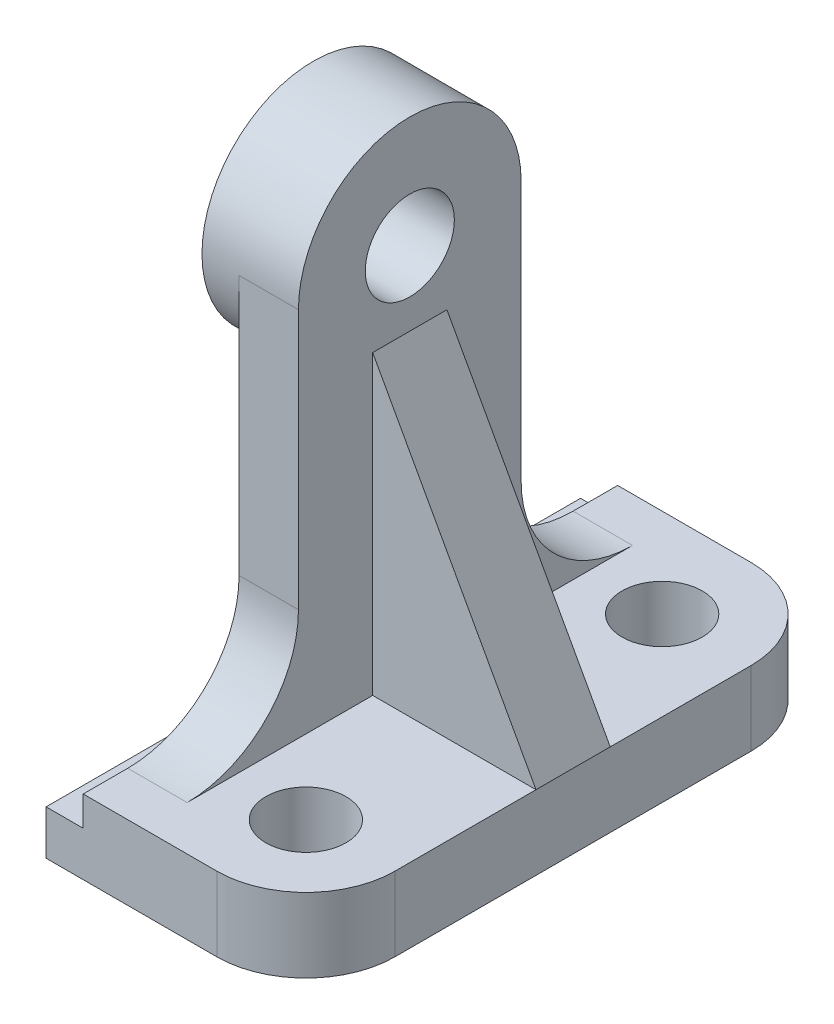
ISO-10303-21;
HEADER;
FILE_DESCRIPTION(('STEP AP214'),'2;1');
FILE_NAME('part.step','',(''),(''),'','','');
FILE_SCHEMA(('AUTOMOTIVE_DESIGN { 1 0 10303 214 1 1 1 1 }'));
ENDSEC;
DATA;
#1=APPLICATION_CONTEXT('core data for automotive mechanical design processes');
#2=APPLICATION_PROTOCOL_DEFINITION('international standard','automotive_design',2000,#1);
#3=PRODUCT_CONTEXT('',#1,'mechanical');
#4=PRODUCT('Part','Part','',(#3));
#5=PRODUCT_RELATED_PRODUCT_CATEGORY('part','',(#4));
#6=PRODUCT_DEFINITION_FORMATION('','',#4);
#7=PRODUCT_DEFINITION_CONTEXT('part definition',#1,'design');
#8=PRODUCT_DEFINITION('design','',#6,#7);
#9=PRODUCT_DEFINITION_SHAPE('','',#8);
#10=(LENGTH_UNIT() NAMED_UNIT(*) SI_UNIT(.MILLI.,.METRE.));
#11=(NAMED_UNIT(*) PLANE_ANGLE_UNIT() SI_UNIT($,.RADIAN.));
#12=(NAMED_UNIT(*) SI_UNIT($,.STERADIAN.) SOLID_ANGLE_UNIT());
#13=UNCERTAINTY_MEASURE_WITH_UNIT(LENGTH_MEASURE(1.E-05),#10,'distance_accuracy_value','');
#14=(GEOMETRIC_REPRESENTATION_CONTEXT(3) GLOBAL_UNCERTAINTY_ASSIGNED_CONTEXT((#13)) GLOBAL_UNIT_ASSIGNED_CONTEXT((#10,
#11,#12)) REPRESENTATION_CONTEXT('',''));
#15=CARTESIAN_POINT('',(0.,0.,0.));
#16=DIRECTION('',(0.,0.,1.));
#17=DIRECTION('',(1.,0.,0.));
#18=AXIS2_PLACEMENT_3D('',#15,#16,#17);
#19=CARTESIAN_POINT('',(5.,10.,36.));
#20=DIRECTION('',(0.,-1.,0.));
#21=DIRECTION('',(0.,0.,-1.));
#22=AXIS2_PLACEMENT_3D('',#19,#20,#21);
#23=PLANE('',#22);
#24=CARTESIAN_POINT('',(23.,10.,-24.));
#25=DIRECTION('',(0.,1.,0.));
#26=DIRECTION('',(0.,0.,1.));
#27=AXIS2_PLACEMENT_3D('',#24,#25,#26);
#28=CIRCLE('',#27,5.4);
#29=CARTESIAN_POINT('',(23.,10.,-18.6));
#30=VERTEX_POINT('',#29);
#31=EDGE_CURVE('E206',#30,#30,#28,.T.);
#32=ORIENTED_EDGE('',*,*,#31,.F.);
#33=EDGE_LOOP('',(#32));
#34=FACE_BOUND('',#33,.T.);
#35=DIRECTION('',(-1.,0.,0.));
#36=VECTOR('',#35,1.);
#37=CARTESIAN_POINT('',(5.,10.,-5.));
#38=LINE('',#37,#36);
#39=CARTESIAN_POINT('',(35.,9.99999999999999,-5.));
#40=VERTEX_POINT('',#39);
#41=CARTESIAN_POINT('',(13.,10.,-5.));
#42=VERTEX_POINT('',#41);
#43=EDGE_CURVE('E176',#40,#42,#38,.T.);
#44=ORIENTED_EDGE('',*,*,#43,.F.);
#45=DIRECTION('',(0.,0.,-1.));
#46=VECTOR('',#45,1.);
#47=CARTESIAN_POINT('',(35.,10.,36.));
#48=LINE('',#47,#46);
#49=CARTESIAN_POINT('',(35.,10.,-24.));
#50=VERTEX_POINT('',#49);
#51=EDGE_CURVE('E160',#40,#50,#48,.T.);
#52=ORIENTED_EDGE('',*,*,#51,.T.);
#53=CARTESIAN_POINT('',(23.,10.,-24.));
#54=DIRECTION('',(0.,-1.,0.));
#55=DIRECTION('',(0.,0.,-1.));
#56=AXIS2_PLACEMENT_3D('',#53,#54,#55);
#57=CIRCLE('',#56,12.);
#58=CARTESIAN_POINT('',(23.,10.,-36.));
#59=VERTEX_POINT('',#58);
#60=EDGE_CURVE('E287',#50,#59,#57,.F.);
#61=ORIENTED_EDGE('',*,*,#60,.T.);
#62=DIRECTION('',(-1.,0.,0.));
#63=VECTOR('',#62,1.);
#64=CARTESIAN_POINT('',(5.,10.,-36.));
#65=LINE('',#64,#63);
#66=CARTESIAN_POINT('',(5.,10.,-36.));
#67=VERTEX_POINT('',#66);
#68=EDGE_CURVE('E261',#59,#67,#65,.T.);
#69=ORIENTED_EDGE('',*,*,#68,.T.);
#70=DIRECTION('',(0.,0.,-1.));
#71=VECTOR('',#70,1.);
#72=CARTESIAN_POINT('',(5.,10.,36.));
#73=LINE('',#72,#71);
#74=CARTESIAN_POINT('',(5.,10.,-30.));
#75=VERTEX_POINT('',#74);
#76=EDGE_CURVE('E277',#75,#67,#73,.T.);
#77=ORIENTED_EDGE('',*,*,#76,.F.);
#78=DIRECTION('',(-1.,0.,0.));
#79=VECTOR('',#78,1.);
#80=CARTESIAN_POINT('',(5.,10.,-30.));
#81=LINE('',#80,#79);
#82=CARTESIAN_POINT('',(13.,10.,-30.));
#83=VERTEX_POINT('',#82);
#84=EDGE_CURVE('E305',#75,#83,#81,.F.);
#85=ORIENTED_EDGE('',*,*,#84,.T.);
#86=DIRECTION('',(0.,0.,1.));
#87=VECTOR('',#86,1.);
#88=CARTESIAN_POINT('',(13.,10.,-15.));
#89=LINE('',#88,#87);
#90=EDGE_CURVE('E178',#83,#42,#89,.T.);
#91=ORIENTED_EDGE('',*,*,#90,.T.);
#92=EDGE_LOOP('',(#44,#52,#61,#69,#77,#85,#91));
#93=FACE_BOUND('',#92,.T.);
#94=ADVANCED_FACE('F43',(#34,#93),#23,.F.);
#95=CARTESIAN_POINT('',(35.,10.,24.));
#96=VERTEX_POINT('',#95);
#97=CARTESIAN_POINT('',(35.,10.,5.));
#98=VERTEX_POINT('',#97);
#99=EDGE_CURVE('E171',#96,#98,#48,.T.);
#100=ORIENTED_EDGE('',*,*,#99,.T.);
#101=DIRECTION('',(-1.,0.,0.));
#102=VECTOR('',#101,1.);
#103=CARTESIAN_POINT('',(5.,10.,5.));
#104=LINE('',#103,#102);
#105=CARTESIAN_POINT('',(13.,10.,5.));
#106=VERTEX_POINT('',#105);
#107=EDGE_CURVE('E196',#98,#106,#104,.T.);
#108=ORIENTED_EDGE('',*,*,#107,.T.);
#109=CARTESIAN_POINT('',(13.,10.,30.));
#110=VERTEX_POINT('',#109);
#111=EDGE_CURVE('E231',#106,#110,#89,.T.);
#112=ORIENTED_EDGE('',*,*,#111,.T.);
#113=DIRECTION('',(-1.,0.,0.));
#114=VECTOR('',#113,1.);
#115=CARTESIAN_POINT('',(5.,10.,30.));
#116=LINE('',#115,#114);
#117=CARTESIAN_POINT('',(5.,10.,30.));
#118=VERTEX_POINT('',#117);
#119=EDGE_CURVE('E302',#110,#118,#116,.T.);
#120=ORIENTED_EDGE('',*,*,#119,.T.);
#121=CARTESIAN_POINT('',(5.,10.,36.));
#122=VERTEX_POINT('',#121);
#123=EDGE_CURVE('E172',#122,#118,#73,.T.);
#124=ORIENTED_EDGE('',*,*,#123,.F.);
#125=DIRECTION('',(-1.,0.,0.));
#126=VECTOR('',#125,1.);
#127=CARTESIAN_POINT('',(5.,10.,36.));
#128=LINE('',#127,#126);
#129=CARTESIAN_POINT('',(23.,10.,36.));
#130=VERTEX_POINT('',#129);
#131=EDGE_CURVE('E249',#130,#122,#128,.T.);
#132=ORIENTED_EDGE('',*,*,#131,.F.);
#133=CARTESIAN_POINT('',(23.,10.,24.));
#134=DIRECTION('',(0.,-1.,0.));
#135=DIRECTION('',(0.,0.,-1.));
#136=AXIS2_PLACEMENT_3D('',#133,#134,#135);
#137=CIRCLE('',#136,12.);
#138=EDGE_CURVE('E285',#130,#96,#137,.F.);
#139=ORIENTED_EDGE('',*,*,#138,.T.);
#140=EDGE_LOOP('',(#100,#108,#112,#120,#124,#132,#139));
#141=FACE_BOUND('',#140,.T.);
#142=CARTESIAN_POINT('',(23.,10.,24.));
#143=DIRECTION('',(0.,1.,0.));
#144=DIRECTION('',(0.,0.,1.));
#145=AXIS2_PLACEMENT_3D('',#142,#143,#144);
#146=CIRCLE('',#145,5.4);
#147=CARTESIAN_POINT('',(23.,10.,29.4));
#148=VERTEX_POINT('',#147);
#149=EDGE_CURVE('E200',#148,#148,#146,.T.);
#150=ORIENTED_EDGE('',*,*,#149,.F.);
#151=EDGE_LOOP('',(#150));
#152=FACE_BOUND('',#151,.T.);
#153=ADVANCED_FACE('F359',(#141,#152),#23,.F.);
#154=CARTESIAN_POINT('',(13.,60.,0.));
#155=DIRECTION('',(-1.,0.,0.));
#156=DIRECTION('',(0.,0.,1.));
#157=AXIS2_PLACEMENT_3D('',#154,#155,#156);
#158=PLANE('',#157);
#159=ORIENTED_EDGE('',*,*,#111,.F.);
#160=DIRECTION('',(0.,1.,0.));
#161=VECTOR('',#160,1.);
#162=CARTESIAN_POINT('',(13.,60.,5.));
#163=LINE('',#162,#161);
#164=CARTESIAN_POINT('',(13.,50.,5.));
#165=VERTEX_POINT('',#164);
#166=EDGE_CURVE('E58',#106,#165,#163,.T.);
#167=ORIENTED_EDGE('',*,*,#166,.T.);
#168=DIRECTION('',(0.,0.,1.));
#169=VECTOR('',#168,1.);
#170=CARTESIAN_POINT('',(13.,50.,0.));
#171=LINE('',#170,#169);
#172=CARTESIAN_POINT('',(13.,50.,-5.));
#173=VERTEX_POINT('',#172);
#174=EDGE_CURVE('E62',#165,#173,#171,.F.);
#175=ORIENTED_EDGE('',*,*,#174,.T.);
#176=DIRECTION('',(0.,1.,0.));
#177=VECTOR('',#176,1.);
#178=CARTESIAN_POINT('',(13.,60.,-5.));
#179=LINE('',#178,#177);
#180=EDGE_CURVE('E181',#42,#173,#179,.T.);
#181=ORIENTED_EDGE('',*,*,#180,.F.);
#182=ORIENTED_EDGE('',*,*,#90,.F.);
#183=CARTESIAN_POINT('',(13.,25.,-30.));
#184=DIRECTION('',(-1.,0.,0.));
#185=DIRECTION('',(0.,0.,1.));
#186=AXIS2_PLACEMENT_3D('',#183,#184,#185);
#187=CIRCLE('',#186,15.);
#188=CARTESIAN_POINT('',(13.,25.,-15.));
#189=VERTEX_POINT('',#188);
#190=EDGE_CURVE('E311',#83,#189,#187,.T.);
#191=ORIENTED_EDGE('',*,*,#190,.T.);
#192=DIRECTION('',(0.,-1.,0.));
#193=VECTOR('',#192,1.);
#194=CARTESIAN_POINT('',(13.,60.,-15.));
#195=LINE('',#194,#193);
#196=CARTESIAN_POINT('',(13.,60.,-15.));
#197=VERTEX_POINT('',#196);
#198=EDGE_CURVE('E227',#197,#189,#195,.T.);
#199=ORIENTED_EDGE('',*,*,#198,.F.);
#200=CARTESIAN_POINT('',(13.,60.,0.));
#201=DIRECTION('',(-1.,0.,0.));
#202=DIRECTION('',(0.,0.,1.));
#203=AXIS2_PLACEMENT_3D('',#200,#201,#202);
#204=CIRCLE('',#203,15.);
#205=CARTESIAN_POINT('',(13.,60.,15.));
#206=VERTEX_POINT('',#205);
#207=EDGE_CURVE('E224',#206,#197,#204,.T.);
#208=ORIENTED_EDGE('',*,*,#207,.F.);
#209=DIRECTION('',(0.,1.,0.));
#210=VECTOR('',#209,1.);
#211=CARTESIAN_POINT('',(13.,10.,15.));
#212=LINE('',#211,#210);
#213=CARTESIAN_POINT('',(13.,25.,15.));
#214=VERTEX_POINT('',#213);
#215=EDGE_CURVE('E233',#214,#206,#212,.T.);
#216=ORIENTED_EDGE('',*,*,#215,.F.);
#217=CARTESIAN_POINT('',(13.,25.,30.));
#218=DIRECTION('',(-1.,0.,0.));
#219=DIRECTION('',(0.,0.,1.));
#220=AXIS2_PLACEMENT_3D('',#217,#218,#219);
#221=CIRCLE('',#220,15.);
#222=EDGE_CURVE('E11',#214,#110,#221,.T.);
#223=ORIENTED_EDGE('',*,*,#222,.T.);
#224=EDGE_LOOP('',(#159,#167,#175,#181,#182,#191,#199,#208,#216,#223));
#225=FACE_BOUND('',#224,.T.);
#226=CARTESIAN_POINT('',(13.,60.,0.));
#227=DIRECTION('',(1.,0.,0.));
#228=DIRECTION('',(0.,0.,-1.));
#229=AXIS2_PLACEMENT_3D('',#226,#227,#228);
#230=CIRCLE('',#229,6.00000000000002);
#231=CARTESIAN_POINT('',(13.,60.,-6.00000000000002));
#232=VERTEX_POINT('',#231);
#233=EDGE_CURVE('E212',#232,#232,#230,.T.);
#234=ORIENTED_EDGE('',*,*,#233,.F.);
#235=EDGE_LOOP('',(#234));
#236=FACE_BOUND('',#235,.T.);
#237=ADVANCED_FACE('F326',(#225,#236),#158,.F.);
#238=CARTESIAN_POINT('',(5.,6.,36.));
#239=DIRECTION('',(1.,0.,0.));
#240=DIRECTION('',(0.,0.,-1.));
#241=AXIS2_PLACEMENT_3D('',#238,#239,#240);
#242=PLANE('',#241);
#243=DIRECTION('',(0.,1.,0.));
#244=VECTOR('',#243,1.);
#245=CARTESIAN_POINT('',(5.,10.,15.));
#246=LINE('',#245,#244);
#247=CARTESIAN_POINT('',(5.,25.,15.));
#248=VERTEX_POINT('',#247);
#249=CARTESIAN_POINT('',(5.,60.,15.));
#250=VERTEX_POINT('',#249);
#251=EDGE_CURVE('E228',#248,#250,#246,.T.);
#252=ORIENTED_EDGE('',*,*,#251,.T.);
#253=CARTESIAN_POINT('',(5.,60.,0.));
#254=DIRECTION('',(-1.,0.,0.));
#255=DIRECTION('',(0.,0.,1.));
#256=AXIS2_PLACEMENT_3D('',#253,#254,#255);
#257=CIRCLE('',#256,15.);
#258=CARTESIAN_POINT('',(5.,60.,-15.));
#259=VERTEX_POINT('',#258);
#260=EDGE_CURVE('E218',#259,#250,#257,.T.);
#261=ORIENTED_EDGE('',*,*,#260,.F.);
#262=DIRECTION('',(0.,-1.,0.));
#263=VECTOR('',#262,1.);
#264=CARTESIAN_POINT('',(5.,60.,-15.));
#265=LINE('',#264,#263);
#266=CARTESIAN_POINT('',(5.,25.,-15.));
#267=VERTEX_POINT('',#266);
#268=EDGE_CURVE('E222',#259,#267,#265,.T.);
#269=ORIENTED_EDGE('',*,*,#268,.T.);
#270=CARTESIAN_POINT('',(5.,25.,-30.));
#271=DIRECTION('',(1.,0.,0.));
#272=DIRECTION('',(0.,0.,-1.));
#273=AXIS2_PLACEMENT_3D('',#270,#271,#272);
#274=CIRCLE('',#273,15.);
#275=EDGE_CURVE('E309',#267,#75,#274,.T.);
#276=ORIENTED_EDGE('',*,*,#275,.T.);
#277=ORIENTED_EDGE('',*,*,#76,.T.);
#278=DIRECTION('',(0.,-1.,0.));
#279=VECTOR('',#278,1.);
#280=CARTESIAN_POINT('',(5.,6.,-36.));
#281=LINE('',#280,#279);
#282=CARTESIAN_POINT('',(5.,6.,-36.));
#283=VERTEX_POINT('',#282);
#284=EDGE_CURVE('E264',#67,#283,#281,.T.);
#285=ORIENTED_EDGE('',*,*,#284,.T.);
#286=DIRECTION('',(0.,0.,-1.));
#287=VECTOR('',#286,1.);
#288=CARTESIAN_POINT('',(5.,6.,36.));
#289=LINE('',#288,#287);
#290=CARTESIAN_POINT('',(5.,6.,36.));
#291=VERTEX_POINT('',#290);
#292=EDGE_CURVE('E275',#291,#283,#289,.T.);
#293=ORIENTED_EDGE('',*,*,#292,.F.);
#294=DIRECTION('',(0.,-1.,0.));
#295=VECTOR('',#294,1.);
#296=CARTESIAN_POINT('',(5.,6.,36.));
#297=LINE('',#296,#295);
#298=EDGE_CURVE('E252',#122,#291,#297,.T.);
#299=ORIENTED_EDGE('',*,*,#298,.F.);
#300=ORIENTED_EDGE('',*,*,#123,.T.);
#301=CARTESIAN_POINT('',(5.,25.,30.));
#302=DIRECTION('',(1.,0.,0.));
#303=DIRECTION('',(0.,0.,-1.));
#304=AXIS2_PLACEMENT_3D('',#301,#302,#303);
#305=CIRCLE('',#304,15.);
#306=EDGE_CURVE('E51',#118,#248,#305,.T.);
#307=ORIENTED_EDGE('',*,*,#306,.T.);
#308=EDGE_LOOP('',(#252,#261,#269,#276,#277,#285,#293,#299,#300,#307));
#309=FACE_BOUND('',#308,.T.);
#310=ADVANCED_FACE('F314',(#309),#242,.F.);
#311=CARTESIAN_POINT('',(35.,0.,36.));
#312=DIRECTION('',(0.,1.,0.));
#313=DIRECTION('',(0.,0.,1.));
#314=AXIS2_PLACEMENT_3D('',#311,#312,#313);
#315=PLANE('',#314);
#316=CARTESIAN_POINT('',(23.,0.,24.));
#317=DIRECTION('',(0.,1.,0.));
#318=DIRECTION('',(0.,0.,1.));
#319=AXIS2_PLACEMENT_3D('',#316,#317,#318);
#320=CIRCLE('',#319,5.4);
#321=CARTESIAN_POINT('',(23.,0.,29.4));
#322=VERTEX_POINT('',#321);
#323=EDGE_CURVE('E203',#322,#322,#320,.T.);
#324=ORIENTED_EDGE('',*,*,#323,.T.);
#325=EDGE_LOOP('',(#324));
#326=FACE_BOUND('',#325,.T.);
#327=DIRECTION('',(0.,0.,-1.));
#328=VECTOR('',#327,1.);
#329=CARTESIAN_POINT('',(0.,0.,36.));
#330=LINE('',#329,#328);
#331=CARTESIAN_POINT('',(0.,0.,36.));
#332=VERTEX_POINT('',#331);
#333=CARTESIAN_POINT('',(0.,0.,-36.));
#334=VERTEX_POINT('',#333);
#335=EDGE_CURVE('E258',#332,#334,#330,.T.);
#336=ORIENTED_EDGE('',*,*,#335,.T.);
#337=DIRECTION('',(1.,0.,0.));
#338=VECTOR('',#337,1.);
#339=CARTESIAN_POINT('',(35.,0.,-36.));
#340=LINE('',#339,#338);
#341=CARTESIAN_POINT('',(23.,0.,-36.));
#342=VERTEX_POINT('',#341);
#343=EDGE_CURVE('E243',#334,#342,#340,.T.);
#344=ORIENTED_EDGE('',*,*,#343,.T.);
#345=CARTESIAN_POINT('',(23.,0.,-24.));
#346=DIRECTION('',(0.,1.,0.));
#347=DIRECTION('',(0.,0.,1.));
#348=AXIS2_PLACEMENT_3D('',#345,#346,#347);
#349=CIRCLE('',#348,12.);
#350=CARTESIAN_POINT('',(35.,0.,-24.));
#351=VERTEX_POINT('',#350);
#352=EDGE_CURVE('E293',#342,#351,#349,.F.);
#353=ORIENTED_EDGE('',*,*,#352,.T.);
#354=DIRECTION('',(0.,0.,-1.));
#355=VECTOR('',#354,1.);
#356=CARTESIAN_POINT('',(35.,0.,36.));
#357=LINE('',#356,#355);
#358=CARTESIAN_POINT('',(35.,0.,24.));
#359=VERTEX_POINT('',#358);
#360=EDGE_CURVE('E280',#359,#351,#357,.T.);
#361=ORIENTED_EDGE('',*,*,#360,.F.);
#362=CARTESIAN_POINT('',(23.,0.,24.));
#363=DIRECTION('',(0.,1.,0.));
#364=DIRECTION('',(0.,0.,1.));
#365=AXIS2_PLACEMENT_3D('',#362,#363,#364);
#366=CIRCLE('',#365,12.);
#367=CARTESIAN_POINT('',(23.,0.,36.));
#368=VERTEX_POINT('',#367);
#369=EDGE_CURVE('E291',#359,#368,#366,.F.);
#370=ORIENTED_EDGE('',*,*,#369,.T.);
#371=DIRECTION('',(1.,0.,0.));
#372=VECTOR('',#371,1.);
#373=CARTESIAN_POINT('',(35.,0.,36.));
#374=LINE('',#373,#372);
#375=EDGE_CURVE('E246',#332,#368,#374,.T.);
#376=ORIENTED_EDGE('',*,*,#375,.F.);
#377=EDGE_LOOP('',(#336,#344,#353,#361,#370,#376));
#378=FACE_BOUND('',#377,.T.);
#379=CARTESIAN_POINT('',(23.,0.,-24.));
#380=DIRECTION('',(0.,1.,0.));
#381=DIRECTION('',(0.,0.,1.));
#382=AXIS2_PLACEMENT_3D('',#379,#380,#381);
#383=CIRCLE('',#382,5.4);
#384=CARTESIAN_POINT('',(23.,0.,-18.6));
#385=VERTEX_POINT('',#384);
#386=EDGE_CURVE('E209',#385,#385,#383,.T.);
#387=ORIENTED_EDGE('',*,*,#386,.T.);
#388=EDGE_LOOP('',(#387));
#389=FACE_BOUND('',#388,.T.);
#390=ADVANCED_FACE('F387',(#326,#378,#389),#315,.F.);
#391=CARTESIAN_POINT('',(35.,10.,36.));
#392=DIRECTION('',(-1.,0.,0.));
#393=DIRECTION('',(0.,0.,1.));
#394=AXIS2_PLACEMENT_3D('',#391,#392,#393);
#395=PLANE('',#394);
#396=ORIENTED_EDGE('',*,*,#360,.T.);
#397=DIRECTION('',(0.,1.,0.));
#398=VECTOR('',#397,1.);
#399=CARTESIAN_POINT('',(35.,10.,-24.));
#400=LINE('',#399,#398);
#401=EDGE_CURVE('E168',#351,#50,#400,.T.);
#402=ORIENTED_EDGE('',*,*,#401,.T.);
#403=ORIENTED_EDGE('',*,*,#51,.F.);
#404=DIRECTION('',(0.,0.,1.));
#405=VECTOR('',#404,1.);
#406=CARTESIAN_POINT('',(35.,10.,36.));
#407=LINE('',#406,#405);
#408=EDGE_CURVE('E165',#98,#40,#407,.F.);
#409=ORIENTED_EDGE('',*,*,#408,.F.);
#410=ORIENTED_EDGE('',*,*,#99,.F.);
#411=DIRECTION('',(0.,1.,0.));
#412=VECTOR('',#411,1.);
#413=CARTESIAN_POINT('',(35.,10.,24.));
#414=LINE('',#413,#412);
#415=EDGE_CURVE('E282',#96,#359,#414,.F.);
#416=ORIENTED_EDGE('',*,*,#415,.T.);
#417=EDGE_LOOP('',(#396,#402,#403,#409,#410,#416));
#418=FACE_BOUND('',#417,.T.);
#419=ADVANCED_FACE('F162',(#418),#395,.F.);
#420=CARTESIAN_POINT('',(0.,6.,36.));
#421=DIRECTION('',(0.,-1.,0.));
#422=DIRECTION('',(0.,0.,-1.));
#423=AXIS2_PLACEMENT_3D('',#420,#421,#422);
#424=PLANE('',#423);
#425=ORIENTED_EDGE('',*,*,#292,.T.);
#426=DIRECTION('',(-1.,0.,0.));
#427=VECTOR('',#426,1.);
#428=CARTESIAN_POINT('',(0.,6.,-36.));
#429=LINE('',#428,#427);
#430=CARTESIAN_POINT('',(0.,6.,-36.));
#431=VERTEX_POINT('',#430);
#432=EDGE_CURVE('E267',#283,#431,#429,.T.);
#433=ORIENTED_EDGE('',*,*,#432,.T.);
#434=DIRECTION('',(0.,0.,-1.));
#435=VECTOR('',#434,1.);
#436=CARTESIAN_POINT('',(0.,6.,36.));
#437=LINE('',#436,#435);
#438=CARTESIAN_POINT('',(0.,6.,36.));
#439=VERTEX_POINT('',#438);
#440=EDGE_CURVE('E273',#439,#431,#437,.T.);
#441=ORIENTED_EDGE('',*,*,#440,.F.);
#442=DIRECTION('',(-1.,0.,0.));
#443=VECTOR('',#442,1.);
#444=CARTESIAN_POINT('',(0.,6.,36.));
#445=LINE('',#444,#443);
#446=EDGE_CURVE('E254',#291,#439,#445,.T.);
#447=ORIENTED_EDGE('',*,*,#446,.F.);
#448=EDGE_LOOP('',(#425,#433,#441,#447));
#449=FACE_BOUND('',#448,.T.);
#450=ADVANCED_FACE('F351',(#449),#424,.F.);
#451=CARTESIAN_POINT('',(0.,0.,36.));
#452=DIRECTION('',(1.,0.,0.));
#453=DIRECTION('',(0.,0.,-1.));
#454=AXIS2_PLACEMENT_3D('',#451,#452,#453);
#455=PLANE('',#454);
#456=ORIENTED_EDGE('',*,*,#440,.T.);
#457=DIRECTION('',(0.,-1.,0.));
#458=VECTOR('',#457,1.);
#459=CARTESIAN_POINT('',(0.,0.,-36.));
#460=LINE('',#459,#458);
#461=EDGE_CURVE('E250',#431,#334,#460,.T.);
#462=ORIENTED_EDGE('',*,*,#461,.T.);
#463=ORIENTED_EDGE('',*,*,#335,.F.);
#464=DIRECTION('',(0.,-1.,0.));
#465=VECTOR('',#464,1.);
#466=CARTESIAN_POINT('',(0.,0.,36.));
#467=LINE('',#466,#465);
#468=EDGE_CURVE('E256',#439,#332,#467,.T.);
#469=ORIENTED_EDGE('',*,*,#468,.F.);
#470=EDGE_LOOP('',(#456,#462,#463,#469));
#471=FACE_BOUND('',#470,.T.);
#472=ADVANCED_FACE('F416',(#471),#455,.F.);
#473=CARTESIAN_POINT('',(0.,0.,36.));
#474=DIRECTION('',(0.,0.,-1.));
#475=DIRECTION('',(-1.,0.,0.));
#476=AXIS2_PLACEMENT_3D('',#473,#474,#475);
#477=PLANE('',#476);
#478=ORIENTED_EDGE('',*,*,#375,.T.);
#479=DIRECTION('',(0.,1.,0.));
#480=VECTOR('',#479,1.);
#481=CARTESIAN_POINT('',(23.,0.,36.));
#482=LINE('',#481,#480);
#483=EDGE_CURVE('E296',#368,#130,#482,.T.);
#484=ORIENTED_EDGE('',*,*,#483,.T.);
#485=ORIENTED_EDGE('',*,*,#131,.T.);
#486=ORIENTED_EDGE('',*,*,#298,.T.);
#487=ORIENTED_EDGE('',*,*,#446,.T.);
#488=ORIENTED_EDGE('',*,*,#468,.T.);
#489=EDGE_LOOP('',(#478,#484,#485,#486,#487,#488));
#490=FACE_BOUND('',#489,.T.);
#491=ADVANCED_FACE('F354',(#490),#477,.F.);
#492=CARTESIAN_POINT('',(0.,0.,-36.));
#493=DIRECTION('',(0.,0.,-1.));
#494=DIRECTION('',(-1.,0.,0.));
#495=AXIS2_PLACEMENT_3D('',#492,#493,#494);
#496=PLANE('',#495);
#497=ORIENTED_EDGE('',*,*,#68,.F.);
#498=DIRECTION('',(0.,1.,0.));
#499=VECTOR('',#498,1.);
#500=CARTESIAN_POINT('',(23.,0.,-36.));
#501=LINE('',#500,#499);
#502=EDGE_CURVE('E289',#59,#342,#501,.F.);
#503=ORIENTED_EDGE('',*,*,#502,.T.);
#504=ORIENTED_EDGE('',*,*,#343,.F.);
#505=ORIENTED_EDGE('',*,*,#461,.F.);
#506=ORIENTED_EDGE('',*,*,#432,.F.);
#507=ORIENTED_EDGE('',*,*,#284,.F.);
#508=EDGE_LOOP('',(#497,#503,#504,#505,#506,#507));
#509=FACE_BOUND('',#508,.T.);
#510=ADVANCED_FACE('F347',(#509),#496,.T.);
#511=CARTESIAN_POINT('',(23.,10.,-24.));
#512=DIRECTION('',(0.,-1.,0.));
#513=DIRECTION('',(0.,0.,-1.));
#514=AXIS2_PLACEMENT_3D('',#511,#512,#513);
#515=CYLINDRICAL_SURFACE('',#514,12.);
#516=ORIENTED_EDGE('',*,*,#352,.F.);
#517=ORIENTED_EDGE('',*,*,#502,.F.);
#518=ORIENTED_EDGE('',*,*,#60,.F.);
#519=ORIENTED_EDGE('',*,*,#401,.F.);
#520=EDGE_LOOP('',(#516,#517,#518,#519));
#521=FACE_BOUND('',#520,.T.);
#522=ADVANCED_FACE('F391',(#521),#515,.T.);
#523=CARTESIAN_POINT('',(23.,0.,24.));
#524=DIRECTION('',(0.,1.,0.));
#525=DIRECTION('',(0.,0.,1.));
#526=AXIS2_PLACEMENT_3D('',#523,#524,#525);
#527=CYLINDRICAL_SURFACE('',#526,12.);
#528=ORIENTED_EDGE('',*,*,#369,.F.);
#529=ORIENTED_EDGE('',*,*,#415,.F.);
#530=ORIENTED_EDGE('',*,*,#138,.F.);
#531=ORIENTED_EDGE('',*,*,#483,.F.);
#532=EDGE_LOOP('',(#528,#529,#530,#531));
#533=FACE_BOUND('',#532,.T.);
#534=ADVANCED_FACE('F394',(#533),#527,.T.);
#535=CARTESIAN_POINT('',(13.,60.,0.));
#536=DIRECTION('',(-1.,0.,0.));
#537=DIRECTION('',(0.,0.,1.));
#538=AXIS2_PLACEMENT_3D('',#535,#536,#537);
#539=CYLINDRICAL_SURFACE('',#538,15.);
#540=CARTESIAN_POINT('',(0.,60.,0.));
#541=DIRECTION('',(-1.,0.,0.));
#542=DIRECTION('',(0.,0.,1.));
#543=AXIS2_PLACEMENT_3D('',#540,#541,#542);
#544=CIRCLE('',#543,15.);
#545=CARTESIAN_POINT('',(0.,60.,15.));
#546=VERTEX_POINT('',#545);
#547=EDGE_CURVE('E219',#546,#546,#544,.T.);
#548=ORIENTED_EDGE('',*,*,#547,.F.);
#549=EDGE_LOOP('',(#548));
#550=FACE_BOUND('',#549,.T.);
#551=ORIENTED_EDGE('',*,*,#260,.T.);
#552=DIRECTION('',(-1.,0.,0.));
#553=VECTOR('',#552,1.);
#554=CARTESIAN_POINT('',(13.,60.,15.));
#555=LINE('',#554,#553);
#556=EDGE_CURVE('E240',#206,#250,#555,.T.);
#557=ORIENTED_EDGE('',*,*,#556,.F.);
#558=ORIENTED_EDGE('',*,*,#207,.T.);
#559=DIRECTION('',(-1.,0.,0.));
#560=VECTOR('',#559,1.);
#561=CARTESIAN_POINT('',(13.,60.,-15.));
#562=LINE('',#561,#560);
#563=EDGE_CURVE('E235',#197,#259,#562,.T.);
#564=ORIENTED_EDGE('',*,*,#563,.T.);
#565=EDGE_LOOP('',(#551,#557,#558,#564));
#566=FACE_BOUND('',#565,.T.);
#567=ADVANCED_FACE('F331',(#550,#566),#539,.T.);
#568=CARTESIAN_POINT('',(13.,10.,15.));
#569=DIRECTION('',(0.,0.,1.));
#570=DIRECTION('',(1.,0.,0.));
#571=AXIS2_PLACEMENT_3D('',#568,#569,#570);
#572=PLANE('',#571);
#573=ORIENTED_EDGE('',*,*,#251,.F.);
#574=DIRECTION('',(-1.,0.,0.));
#575=VECTOR('',#574,1.);
#576=CARTESIAN_POINT('',(13.,25.,15.));
#577=LINE('',#576,#575);
#578=EDGE_CURVE('E307',#248,#214,#577,.F.);
#579=ORIENTED_EDGE('',*,*,#578,.T.);
#580=ORIENTED_EDGE('',*,*,#215,.T.);
#581=ORIENTED_EDGE('',*,*,#556,.T.);
#582=EDGE_LOOP('',(#573,#579,#580,#581));
#583=FACE_BOUND('',#582,.T.);
#584=ADVANCED_FACE('F322',(#583),#572,.T.);
#585=CARTESIAN_POINT('',(13.,60.,-15.));
#586=DIRECTION('',(0.,0.,-1.));
#587=DIRECTION('',(-1.,0.,0.));
#588=AXIS2_PLACEMENT_3D('',#585,#586,#587);
#589=PLANE('',#588);
#590=ORIENTED_EDGE('',*,*,#198,.T.);
#591=DIRECTION('',(-1.,0.,0.));
#592=VECTOR('',#591,1.);
#593=CARTESIAN_POINT('',(13.,25.,-15.));
#594=LINE('',#593,#592);
#595=EDGE_CURVE('E299',#189,#267,#594,.T.);
#596=ORIENTED_EDGE('',*,*,#595,.T.);
#597=ORIENTED_EDGE('',*,*,#268,.F.);
#598=ORIENTED_EDGE('',*,*,#563,.F.);
#599=EDGE_LOOP('',(#590,#596,#597,#598));
#600=FACE_BOUND('',#599,.T.);
#601=ADVANCED_FACE('F334',(#600),#589,.T.);
#602=CARTESIAN_POINT('',(13.,25.,-30.));
#603=DIRECTION('',(-1.,0.,0.));
#604=DIRECTION('',(0.,0.,1.));
#605=AXIS2_PLACEMENT_3D('',#602,#603,#604);
#606=CYLINDRICAL_SURFACE('',#605,15.);
#607=ORIENTED_EDGE('',*,*,#190,.F.);
#608=ORIENTED_EDGE('',*,*,#84,.F.);
#609=ORIENTED_EDGE('',*,*,#275,.F.);
#610=ORIENTED_EDGE('',*,*,#595,.F.);
#611=EDGE_LOOP('',(#607,#608,#609,#610));
#612=FACE_BOUND('',#611,.T.);
#613=ADVANCED_FACE('F338',(#612),#606,.F.);
#614=CARTESIAN_POINT('',(5.,25.,30.));
#615=DIRECTION('',(-1.,0.,0.));
#616=DIRECTION('',(0.,0.,1.));
#617=AXIS2_PLACEMENT_3D('',#614,#615,#616);
#618=CYLINDRICAL_SURFACE('',#617,15.);
#619=ORIENTED_EDGE('',*,*,#222,.F.);
#620=ORIENTED_EDGE('',*,*,#578,.F.);
#621=ORIENTED_EDGE('',*,*,#306,.F.);
#622=ORIENTED_EDGE('',*,*,#119,.F.);
#623=EDGE_LOOP('',(#619,#620,#621,#622));
#624=FACE_BOUND('',#623,.T.);
#625=ADVANCED_FACE('F45',(#624),#618,.F.);
#626=CARTESIAN_POINT('',(0.,60.,0.));
#627=DIRECTION('',(-1.,0.,0.));
#628=DIRECTION('',(0.,0.,1.));
#629=AXIS2_PLACEMENT_3D('',#626,#627,#628);
#630=PLANE('',#629);
#631=CARTESIAN_POINT('',(0.,60.,0.));
#632=DIRECTION('',(-1.,0.,0.));
#633=DIRECTION('',(0.,0.,1.));
#634=AXIS2_PLACEMENT_3D('',#631,#632,#633);
#635=CIRCLE('',#634,6.00000000000001);
#636=CARTESIAN_POINT('',(0.,60.,6.00000000000001));
#637=VERTEX_POINT('',#636);
#638=EDGE_CURVE('E215',#637,#637,#635,.T.);
#639=ORIENTED_EDGE('',*,*,#638,.F.);
#640=EDGE_LOOP('',(#639));
#641=FACE_BOUND('',#640,.T.);
#642=ORIENTED_EDGE('',*,*,#547,.T.);
#643=EDGE_LOOP('',(#642));
#644=FACE_BOUND('',#643,.T.);
#645=ADVANCED_FACE('F403',(#641,#644),#630,.T.);
#646=CARTESIAN_POINT('',(13.,60.,0.));
#647=DIRECTION('',(1.,0.,0.));
#648=DIRECTION('',(0.,0.,-1.));
#649=AXIS2_PLACEMENT_3D('',#646,#647,#648);
#650=CYLINDRICAL_SURFACE('',#649,6.00000000000001);
#651=ORIENTED_EDGE('',*,*,#638,.T.);
#652=EDGE_LOOP('',(#651));
#653=FACE_BOUND('',#652,.T.);
#654=ORIENTED_EDGE('',*,*,#233,.T.);
#655=EDGE_LOOP('',(#654));
#656=FACE_BOUND('',#655,.T.);
#657=ADVANCED_FACE('F445',(#653,#656),#650,.F.);
#658=CARTESIAN_POINT('',(23.,10.,-24.));
#659=DIRECTION('',(0.,1.,0.));
#660=DIRECTION('',(0.,0.,1.));
#661=AXIS2_PLACEMENT_3D('',#658,#659,#660);
#662=CYLINDRICAL_SURFACE('',#661,5.4);
#663=ORIENTED_EDGE('',*,*,#386,.F.);
#664=EDGE_LOOP('',(#663));
#665=FACE_BOUND('',#664,.T.);
#666=ORIENTED_EDGE('',*,*,#31,.T.);
#667=EDGE_LOOP('',(#666));
#668=FACE_BOUND('',#667,.T.);
#669=ADVANCED_FACE('F454',(#665,#668),#662,.F.);
#670=CARTESIAN_POINT('',(23.,10.,24.));
#671=DIRECTION('',(0.,1.,0.));
#672=DIRECTION('',(0.,0.,1.));
#673=AXIS2_PLACEMENT_3D('',#670,#671,#672);
#674=CYLINDRICAL_SURFACE('',#673,5.4);
#675=ORIENTED_EDGE('',*,*,#323,.F.);
#676=EDGE_LOOP('',(#675));
#677=FACE_BOUND('',#676,.T.);
#678=ORIENTED_EDGE('',*,*,#149,.T.);
#679=EDGE_LOOP('',(#678));
#680=FACE_BOUND('',#679,.T.);
#681=ADVANCED_FACE('F371',(#677,#680),#674,.F.);
#682=CARTESIAN_POINT('',(13.,50.,0.));
#683=DIRECTION('',(-0.876215908676647,-0.481918749772156,0.));
#684=DIRECTION('',(0.481918749772156,-0.876215908676647,0.));
#685=AXIS2_PLACEMENT_3D('',#682,#683,#684);
#686=PLANE('',#685);
#687=ORIENTED_EDGE('',*,*,#174,.F.);
#688=DIRECTION('',(0.481918749772156,-0.876215908676647,0.));
#689=VECTOR('',#688,1.);
#690=CARTESIAN_POINT('',(13.,50.,5.));
#691=LINE('',#690,#689);
#692=EDGE_CURVE('E182',#165,#98,#691,.T.);
#693=ORIENTED_EDGE('',*,*,#692,.T.);
#694=ORIENTED_EDGE('',*,*,#408,.T.);
#695=DIRECTION('',(0.481918749772156,-0.876215908676647,0.));
#696=VECTOR('',#695,1.);
#697=CARTESIAN_POINT('',(13.,50.,-5.));
#698=LINE('',#697,#696);
#699=EDGE_CURVE('E188',#173,#40,#698,.T.);
#700=ORIENTED_EDGE('',*,*,#699,.F.);
#701=EDGE_LOOP('',(#687,#693,#694,#700));
#702=FACE_BOUND('',#701,.T.);
#703=ADVANCED_FACE('F187',(#702),#686,.F.);
#704=CARTESIAN_POINT('',(17.5,37.5,5.));
#705=DIRECTION('',(0.,0.,1.));
#706=DIRECTION('',(1.,0.,0.));
#707=AXIS2_PLACEMENT_3D('',#704,#705,#706);
#708=PLANE('',#707);
#709=ORIENTED_EDGE('',*,*,#166,.F.);
#710=ORIENTED_EDGE('',*,*,#107,.F.);
#711=ORIENTED_EDGE('',*,*,#692,.F.);
#712=EDGE_LOOP('',(#709,#710,#711));
#713=FACE_BOUND('',#712,.T.);
#714=ADVANCED_FACE('F363',(#713),#708,.T.);
#715=CARTESIAN_POINT('',(17.5,37.5,-5.));
#716=DIRECTION('',(0.,0.,1.));
#717=DIRECTION('',(1.,0.,0.));
#718=AXIS2_PLACEMENT_3D('',#715,#716,#717);
#719=PLANE('',#718);
#720=ORIENTED_EDGE('',*,*,#43,.T.);
#721=ORIENTED_EDGE('',*,*,#180,.T.);
#722=ORIENTED_EDGE('',*,*,#699,.T.);
#723=EDGE_LOOP('',(#720,#721,#722));
#724=FACE_BOUND('',#723,.T.);
#725=ADVANCED_FACE('F191',(#724),#719,.F.);
#726=CLOSED_SHELL('',(#94,#153,#237,#310,#390,#419,#450,#472,#491,#510,#522,#534,#567,#584,#601,
#613,#625,#645,#657,#669,#681,#703,#714,#725));
#727=MANIFOLD_SOLID_BREP('B2',#726);
#728=ADVANCED_BREP_SHAPE_REPRESENTATION('',(#18,#727),#14);
#729=SHAPE_DEFINITION_REPRESENTATION(#9,#728);
ENDSEC;
END-ISO-10303-21;
